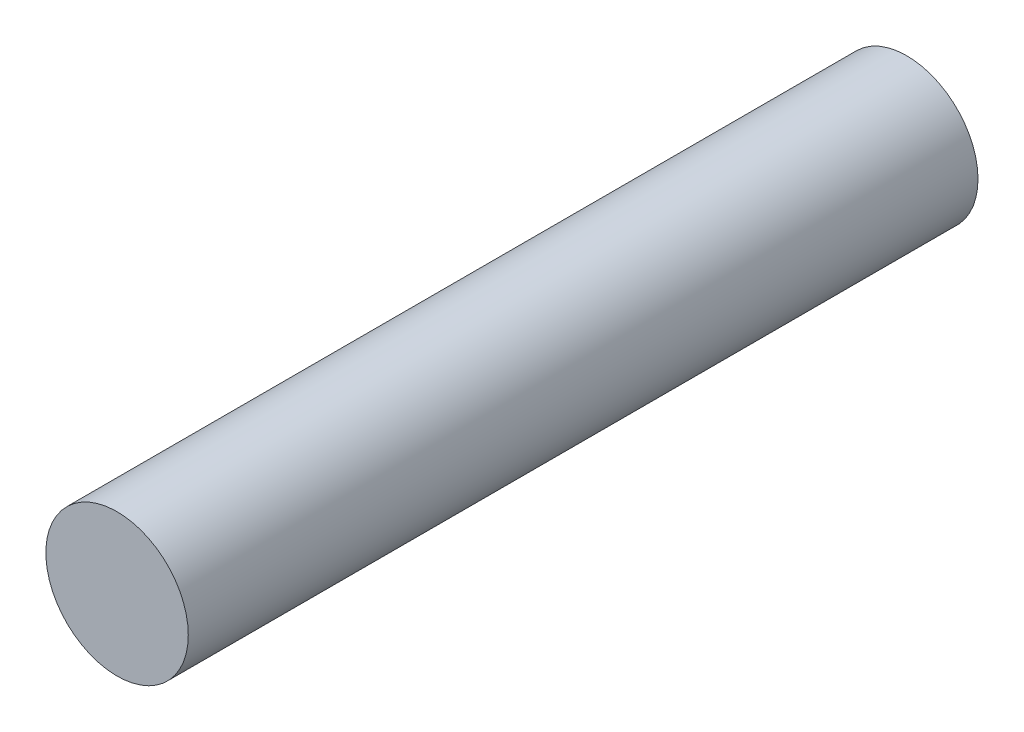
ISO-10303-21;
HEADER;
FILE_DESCRIPTION(('STEP AP214'),'2;1');
FILE_NAME('part.step','',(''),(''),'','','');
FILE_SCHEMA(('AUTOMOTIVE_DESIGN { 1 0 10303 214 1 1 1 1 }'));
ENDSEC;
DATA;
#1=APPLICATION_CONTEXT('core data for automotive mechanical design processes');
#2=APPLICATION_PROTOCOL_DEFINITION('international standard','automotive_design',2000,#1);
#3=PRODUCT_CONTEXT('',#1,'mechanical');
#4=PRODUCT('Part','Part','',(#3));
#5=PRODUCT_RELATED_PRODUCT_CATEGORY('part','',(#4));
#6=PRODUCT_DEFINITION_FORMATION('','',#4);
#7=PRODUCT_DEFINITION_CONTEXT('part definition',#1,'design');
#8=PRODUCT_DEFINITION('design','',#6,#7);
#9=PRODUCT_DEFINITION_SHAPE('','',#8);
#10=(LENGTH_UNIT() NAMED_UNIT(*) SI_UNIT(.MILLI.,.METRE.));
#11=(NAMED_UNIT(*) PLANE_ANGLE_UNIT() SI_UNIT($,.RADIAN.));
#12=(NAMED_UNIT(*) SI_UNIT($,.STERADIAN.) SOLID_ANGLE_UNIT());
#13=UNCERTAINTY_MEASURE_WITH_UNIT(LENGTH_MEASURE(1.E-05),#10,'distance_accuracy_value','');
#14=(GEOMETRIC_REPRESENTATION_CONTEXT(3) GLOBAL_UNCERTAINTY_ASSIGNED_CONTEXT((#13)) GLOBAL_UNIT_ASSIGNED_CONTEXT((#10,
#11,#12)) REPRESENTATION_CONTEXT('',''));
#15=CARTESIAN_POINT('',(0.,0.,0.));
#16=DIRECTION('',(0.,0.,1.));
#17=DIRECTION('',(1.,0.,0.));
#18=AXIS2_PLACEMENT_3D('',#15,#16,#17);
#19=CARTESIAN_POINT('',(0.,0.,30.));
#20=DIRECTION('',(0.,0.,-1.));
#21=DIRECTION('',(-1.,0.,0.));
#22=AXIS2_PLACEMENT_3D('',#19,#20,#21);
#23=CYLINDRICAL_SURFACE('',#22,2.7051);
#24=CARTESIAN_POINT('',(0.,0.,30.));
#25=DIRECTION('',(0.,0.,1.));
#26=DIRECTION('',(1.,0.,0.));
#27=AXIS2_PLACEMENT_3D('',#24,#25,#26);
#28=CIRCLE('',#27,2.7051);
#29=CARTESIAN_POINT('',(2.7051,0.,30.));
#30=VERTEX_POINT('',#29);
#31=EDGE_CURVE('E10',#30,#30,#28,.T.);
#32=ORIENTED_EDGE('',*,*,#31,.F.);
#33=EDGE_LOOP('',(#32));
#34=FACE_BOUND('',#33,.T.);
#35=CARTESIAN_POINT('',(0.,0.,0.));
#36=DIRECTION('',(0.,0.,1.));
#37=DIRECTION('',(1.,0.,0.));
#38=AXIS2_PLACEMENT_3D('',#35,#36,#37);
#39=CIRCLE('',#38,2.7051);
#40=CARTESIAN_POINT('',(2.7051,0.,0.));
#41=VERTEX_POINT('',#40);
#42=EDGE_CURVE('E46',#41,#41,#39,.T.);
#43=ORIENTED_EDGE('',*,*,#42,.T.);
#44=EDGE_LOOP('',(#43));
#45=FACE_BOUND('',#44,.T.);
#46=ADVANCED_FACE('F43',(#34,#45),#23,.T.);
#47=CARTESIAN_POINT('',(0.,0.,30.));
#48=DIRECTION('',(0.,0.,1.));
#49=DIRECTION('',(1.,0.,0.));
#50=AXIS2_PLACEMENT_3D('',#47,#48,#49);
#51=PLANE('',#50);
#52=ORIENTED_EDGE('',*,*,#31,.T.);
#53=EDGE_LOOP('',(#52));
#54=FACE_BOUND('',#53,.T.);
#55=ADVANCED_FACE('F60',(#54),#51,.T.);
#56=CARTESIAN_POINT('',(0.,0.,0.));
#57=DIRECTION('',(0.,0.,1.));
#58=DIRECTION('',(1.,0.,0.));
#59=AXIS2_PLACEMENT_3D('',#56,#57,#58);
#60=PLANE('',#59);
#61=ORIENTED_EDGE('',*,*,#42,.F.);
#62=EDGE_LOOP('',(#61));
#63=FACE_BOUND('',#62,.T.);
#64=ADVANCED_FACE('F58',(#63),#60,.F.);
#65=CLOSED_SHELL('',(#46,#55,#64));
#66=MANIFOLD_SOLID_BREP('B2',#65);
#67=ADVANCED_BREP_SHAPE_REPRESENTATION('',(#18,#66),#14);
#68=SHAPE_DEFINITION_REPRESENTATION(#9,#67);
ENDSEC;
END-ISO-10303-21;
